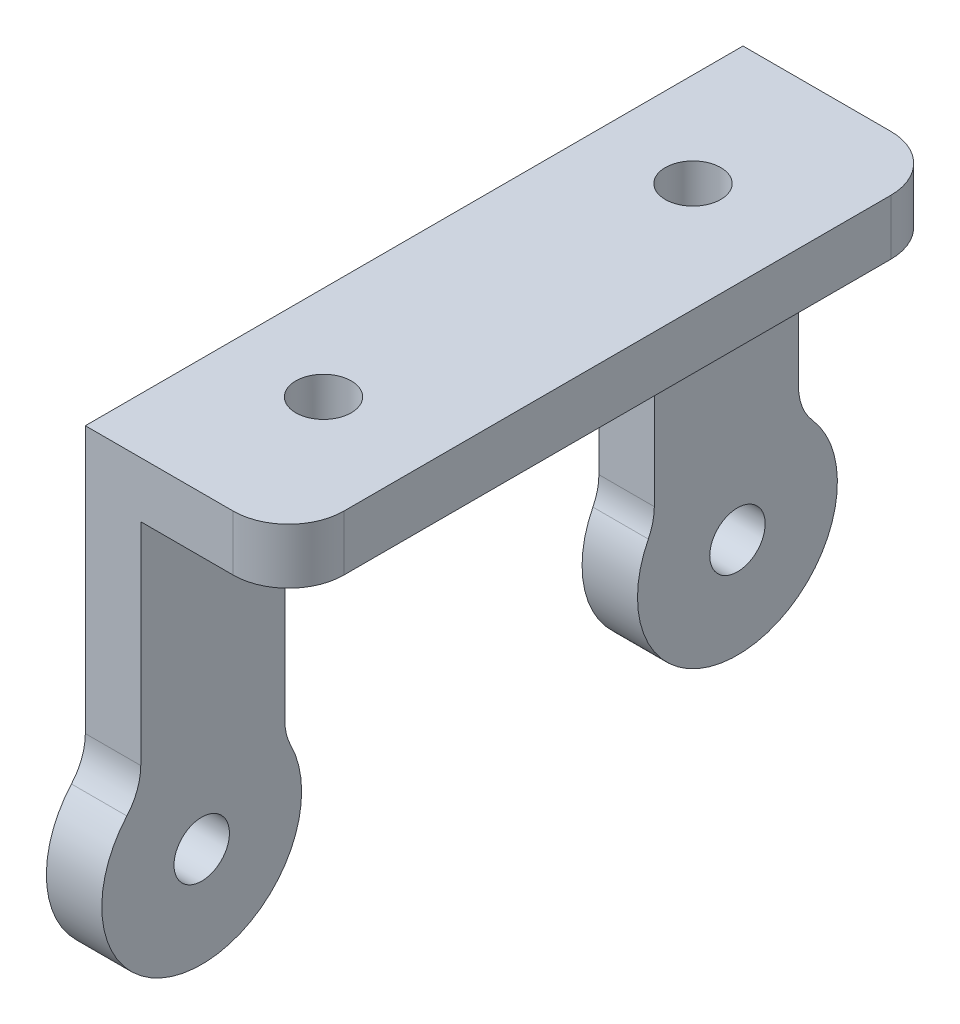
ISO-10303-21;
HEADER;
FILE_DESCRIPTION(('STEP AP214'),'2;1');
FILE_NAME('part.step','',(''),(''),'','','');
FILE_SCHEMA(('AUTOMOTIVE_DESIGN { 1 0 10303 214 1 1 1 1 }'));
ENDSEC;
DATA;
#1=APPLICATION_CONTEXT('core data for automotive mechanical design processes');
#2=APPLICATION_PROTOCOL_DEFINITION('international standard','automotive_design',2000,#1);
#3=PRODUCT_CONTEXT('',#1,'mechanical');
#4=PRODUCT('Part','Part','',(#3));
#5=PRODUCT_RELATED_PRODUCT_CATEGORY('part','',(#4));
#6=PRODUCT_DEFINITION_FORMATION('','',#4);
#7=PRODUCT_DEFINITION_CONTEXT('part definition',#1,'design');
#8=PRODUCT_DEFINITION('design','',#6,#7);
#9=PRODUCT_DEFINITION_SHAPE('','',#8);
#10=(LENGTH_UNIT() NAMED_UNIT(*) SI_UNIT(.MILLI.,.METRE.));
#11=(NAMED_UNIT(*) PLANE_ANGLE_UNIT() SI_UNIT($,.RADIAN.));
#12=(NAMED_UNIT(*) SI_UNIT($,.STERADIAN.) SOLID_ANGLE_UNIT());
#13=UNCERTAINTY_MEASURE_WITH_UNIT(LENGTH_MEASURE(1.E-05),#10,'distance_accuracy_value','');
#14=(GEOMETRIC_REPRESENTATION_CONTEXT(3) GLOBAL_UNCERTAINTY_ASSIGNED_CONTEXT((#13)) GLOBAL_UNIT_ASSIGNED_CONTEXT((#10,
#11,#12)) REPRESENTATION_CONTEXT('',''));
#15=CARTESIAN_POINT('',(0.,0.,0.));
#16=DIRECTION('',(0.,0.,1.));
#17=DIRECTION('',(1.,0.,0.));
#18=AXIS2_PLACEMENT_3D('',#15,#16,#17);
#19=CARTESIAN_POINT('',(3.,-15.,35.6));
#20=DIRECTION('',(-1.,0.,0.));
#21=DIRECTION('',(0.,-1.,0.));
#22=AXIS2_PLACEMENT_3D('',#19,#20,#21);
#23=PLANE('',#22);
#24=DIRECTION('',(0.,1.,0.));
#25=VECTOR('',#24,1.);
#26=CARTESIAN_POINT('',(3.,-15.,35.6));
#27=LINE('',#26,#25);
#28=CARTESIAN_POINT('',(3.,8.56865885821496,35.6));
#29=VERTEX_POINT('',#28);
#30=CARTESIAN_POINT('',(3.,20.,35.6));
#31=VERTEX_POINT('',#30);
#32=EDGE_CURVE('E201',#29,#31,#27,.T.);
#33=ORIENTED_EDGE('',*,*,#32,.F.);
#34=CARTESIAN_POINT('',(3.,8.56865885821496,38.6));
#35=DIRECTION('',(-1.,0.,0.));
#36=DIRECTION('',(0.,-1.,0.));
#37=AXIS2_PLACEMENT_3D('',#34,#35,#36);
#38=CIRCLE('',#37,3.);
#39=CARTESIAN_POINT('',(3.,6.58182167323032,36.3522282143504));
#40=VERTEX_POINT('',#39);
#41=EDGE_CURVE('E319',#29,#40,#38,.T.);
#42=ORIENTED_EDGE('',*,*,#41,.T.);
#43=CARTESIAN_POINT('',(3.,3.,32.3));
#44=DIRECTION('',(-1.,0.,0.));
#45=DIRECTION('',(0.,-1.,0.));
#46=AXIS2_PLACEMENT_3D('',#43,#44,#45);
#47=CIRCLE('',#46,5.40832691319599);
#48=CARTESIAN_POINT('',(3.,5.44504406971863,27.47591879244));
#49=VERTEX_POINT('',#48);
#50=EDGE_CURVE('E370',#49,#40,#47,.T.);
#51=ORIENTED_EDGE('',*,*,#50,.F.);
#52=CARTESIAN_POINT('',(3.,6.8013104949709,24.8));
#53=DIRECTION('',(-1.,0.,0.));
#54=DIRECTION('',(0.,-1.,0.));
#55=AXIS2_PLACEMENT_3D('',#52,#53,#54);
#56=CIRCLE('',#55,3.);
#57=CARTESIAN_POINT('',(3.,6.8013104949709,27.8));
#58=VERTEX_POINT('',#57);
#59=EDGE_CURVE('E339',#49,#58,#56,.T.);
#60=ORIENTED_EDGE('',*,*,#59,.T.);
#61=DIRECTION('',(0.,1.,0.));
#62=VECTOR('',#61,1.);
#63=CARTESIAN_POINT('',(3.,-15.,27.8));
#64=LINE('',#63,#62);
#65=CARTESIAN_POINT('',(3.,20.,27.8));
#66=VERTEX_POINT('',#65);
#67=EDGE_CURVE('E225',#58,#66,#64,.T.);
#68=ORIENTED_EDGE('',*,*,#67,.T.);
#69=DIRECTION('',(0.,0.,-1.));
#70=VECTOR('',#69,1.);
#71=CARTESIAN_POINT('',(3.,20.,35.6));
#72=LINE('',#71,#70);
#73=EDGE_CURVE('E159',#31,#66,#72,.T.);
#74=ORIENTED_EDGE('',*,*,#73,.F.);
#75=EDGE_LOOP('',(#33,#42,#51,#60,#68,#74));
#76=FACE_BOUND('',#75,.T.);
#77=CARTESIAN_POINT('',(3.,3.,32.3));
#78=DIRECTION('',(-1.,0.,0.));
#79=DIRECTION('',(0.,-1.,0.));
#80=AXIS2_PLACEMENT_3D('',#77,#78,#79);
#81=CIRCLE('',#80,1.5);
#82=CARTESIAN_POINT('',(3.,1.5,32.3));
#83=VERTEX_POINT('',#82);
#84=EDGE_CURVE('E361',#83,#83,#81,.T.);
#85=ORIENTED_EDGE('',*,*,#84,.T.);
#86=EDGE_LOOP('',(#85));
#87=FACE_BOUND('',#86,.T.);
#88=ADVANCED_FACE('F50',(#76,#87),#23,.F.);
#89=CARTESIAN_POINT('',(0.,23.,35.6));
#90=DIRECTION('',(1.,0.,0.));
#91=DIRECTION('',(0.,1.,0.));
#92=AXIS2_PLACEMENT_3D('',#89,#90,#91);
#93=PLANE('',#92);
#94=DIRECTION('',(0.,-1.,0.));
#95=VECTOR('',#94,1.);
#96=CARTESIAN_POINT('',(0.,23.,0.));
#97=LINE('',#96,#95);
#98=CARTESIAN_POINT('',(0.,23.,0.));
#99=VERTEX_POINT('',#98);
#100=CARTESIAN_POINT('',(0.,8.57118479320152,0.));
#101=VERTEX_POINT('',#100);
#102=EDGE_CURVE('E191',#99,#101,#97,.T.);
#103=ORIENTED_EDGE('',*,*,#102,.T.);
#104=CARTESIAN_POINT('',(0.,8.57118479320152,-3.));
#105=DIRECTION('',(1.,0.,0.));
#106=DIRECTION('',(0.,1.,0.));
#107=AXIS2_PLACEMENT_3D('',#104,#105,#106);
#108=CIRCLE('',#107,3.);
#109=CARTESIAN_POINT('',(0.,6.58384182297505,-0.752675386444706));
#110=VERTEX_POINT('',#109);
#111=EDGE_CURVE('E313',#101,#110,#108,.T.);
#112=ORIENTED_EDGE('',*,*,#111,.T.);
#113=CARTESIAN_POINT('',(0.,2.99999999999999,3.3));
#114=DIRECTION('',(-1.,0.,0.));
#115=DIRECTION('',(0.,-1.,0.));
#116=AXIS2_PLACEMENT_3D('',#113,#114,#115);
#117=CIRCLE('',#116,5.41);
#118=CARTESIAN_POINT('',(0.,5.44769361687676,8.12461355529132));
#119=VERTEX_POINT('',#118);
#120=EDGE_CURVE('E291',#110,#119,#117,.T.);
#121=ORIENTED_EDGE('',*,*,#120,.T.);
#122=CARTESIAN_POINT('',(0.,6.80500985544058,10.8));
#123=DIRECTION('',(1.,0.,0.));
#124=DIRECTION('',(0.,1.,0.));
#125=AXIS2_PLACEMENT_3D('',#122,#123,#124);
#126=CIRCLE('',#125,3.);
#127=CARTESIAN_POINT('',(0.,6.80500985544058,7.8));
#128=VERTEX_POINT('',#127);
#129=EDGE_CURVE('E228',#119,#128,#126,.T.);
#130=ORIENTED_EDGE('',*,*,#129,.T.);
#131=DIRECTION('',(0.,-1.,0.));
#132=VECTOR('',#131,1.);
#133=CARTESIAN_POINT('',(0.,-15.,7.8));
#134=LINE('',#133,#132);
#135=CARTESIAN_POINT('',(0.,20.,7.8));
#136=VERTEX_POINT('',#135);
#137=EDGE_CURVE('E54',#136,#128,#134,.T.);
#138=ORIENTED_EDGE('',*,*,#137,.F.);
#139=DIRECTION('',(0.,0.,-1.));
#140=VECTOR('',#139,1.);
#141=CARTESIAN_POINT('',(0.,20.,7.8));
#142=LINE('',#141,#140);
#143=CARTESIAN_POINT('',(0.,20.,27.8));
#144=VERTEX_POINT('',#143);
#145=EDGE_CURVE('E204',#144,#136,#142,.T.);
#146=ORIENTED_EDGE('',*,*,#145,.F.);
#147=DIRECTION('',(0.,1.,0.));
#148=VECTOR('',#147,1.);
#149=CARTESIAN_POINT('',(0.,-15.,27.8));
#150=LINE('',#149,#148);
#151=CARTESIAN_POINT('',(0.,6.8013104949709,27.8));
#152=VERTEX_POINT('',#151);
#153=EDGE_CURVE('E120',#152,#144,#150,.T.);
#154=ORIENTED_EDGE('',*,*,#153,.F.);
#155=CARTESIAN_POINT('',(0.,6.8013104949709,24.8));
#156=DIRECTION('',(1.,0.,0.));
#157=DIRECTION('',(0.,1.,0.));
#158=AXIS2_PLACEMENT_3D('',#155,#156,#157);
#159=CIRCLE('',#158,3.);
#160=CARTESIAN_POINT('',(0.,5.44504406971863,27.47591879244));
#161=VERTEX_POINT('',#160);
#162=EDGE_CURVE('E343',#152,#161,#159,.T.);
#163=ORIENTED_EDGE('',*,*,#162,.T.);
#164=CARTESIAN_POINT('',(0.,3.,32.3));
#165=DIRECTION('',(-1.,0.,0.));
#166=DIRECTION('',(0.,-1.,0.));
#167=AXIS2_PLACEMENT_3D('',#164,#165,#166);
#168=CIRCLE('',#167,5.40832691319599);
#169=CARTESIAN_POINT('',(0.,6.58182167323032,36.3522282143504));
#170=VERTEX_POINT('',#169);
#171=EDGE_CURVE('E369',#161,#170,#168,.T.);
#172=ORIENTED_EDGE('',*,*,#171,.T.);
#173=CARTESIAN_POINT('',(0.,8.56865885821496,38.6));
#174=DIRECTION('',(1.,0.,0.));
#175=DIRECTION('',(0.,1.,0.));
#176=AXIS2_PLACEMENT_3D('',#173,#174,#175);
#177=CIRCLE('',#176,3.);
#178=CARTESIAN_POINT('',(0.,8.56865885821496,35.6));
#179=VERTEX_POINT('',#178);
#180=EDGE_CURVE('E335',#170,#179,#177,.T.);
#181=ORIENTED_EDGE('',*,*,#180,.T.);
#182=DIRECTION('',(0.,-1.,0.));
#183=VECTOR('',#182,1.);
#184=CARTESIAN_POINT('',(0.,23.,35.6));
#185=LINE('',#184,#183);
#186=CARTESIAN_POINT('',(0.,23.,35.6));
#187=VERTEX_POINT('',#186);
#188=EDGE_CURVE('E137',#187,#179,#185,.T.);
#189=ORIENTED_EDGE('',*,*,#188,.F.);
#190=DIRECTION('',(0.,0.,-1.));
#191=VECTOR('',#190,1.);
#192=CARTESIAN_POINT('',(0.,23.,35.6));
#193=LINE('',#192,#191);
#194=EDGE_CURVE('E186',#187,#99,#193,.T.);
#195=ORIENTED_EDGE('',*,*,#194,.T.);
#196=EDGE_LOOP('',(#103,#112,#121,#130,#138,#146,#154,#163,#172,#181,#189,#195));
#197=FACE_BOUND('',#196,.T.);
#198=CARTESIAN_POINT('',(0.,2.99999999999999,3.3));
#199=DIRECTION('',(-1.,0.,0.));
#200=DIRECTION('',(0.,0.,1.));
#201=AXIS2_PLACEMENT_3D('',#198,#199,#200);
#202=CIRCLE('',#201,1.5);
#203=CARTESIAN_POINT('',(0.,2.99999999999999,4.8));
#204=VERTEX_POINT('',#203);
#205=EDGE_CURVE('E314',#204,#204,#202,.T.);
#206=ORIENTED_EDGE('',*,*,#205,.F.);
#207=EDGE_LOOP('',(#206));
#208=FACE_BOUND('',#207,.T.);
#209=CARTESIAN_POINT('',(0.,3.,32.3));
#210=DIRECTION('',(-1.,0.,0.));
#211=DIRECTION('',(0.,0.,-1.));
#212=AXIS2_PLACEMENT_3D('',#209,#210,#211);
#213=CIRCLE('',#212,1.5);
#214=CARTESIAN_POINT('',(0.,3.,30.8));
#215=VERTEX_POINT('',#214);
#216=EDGE_CURVE('E365',#215,#215,#213,.T.);
#217=ORIENTED_EDGE('',*,*,#216,.F.);
#218=EDGE_LOOP('',(#217));
#219=FACE_BOUND('',#218,.T.);
#220=ADVANCED_FACE('F52',(#197,#208,#219),#93,.F.);
#221=DIRECTION('',(0.,-1.,0.));
#222=VECTOR('',#221,1.);
#223=CARTESIAN_POINT('',(3.,-15.,7.8));
#224=LINE('',#223,#222);
#225=CARTESIAN_POINT('',(3.,20.,7.8));
#226=VERTEX_POINT('',#225);
#227=CARTESIAN_POINT('',(3.,6.80500985544058,7.8));
#228=VERTEX_POINT('',#227);
#229=EDGE_CURVE('E190',#226,#228,#224,.T.);
#230=ORIENTED_EDGE('',*,*,#229,.T.);
#231=CARTESIAN_POINT('',(3.,6.80500985544058,10.8));
#232=DIRECTION('',(-1.,0.,0.));
#233=DIRECTION('',(0.,-1.,0.));
#234=AXIS2_PLACEMENT_3D('',#231,#232,#233);
#235=CIRCLE('',#234,3.);
#236=CARTESIAN_POINT('',(3.,5.44769361687676,8.12461355529132));
#237=VERTEX_POINT('',#236);
#238=EDGE_CURVE('E298',#228,#237,#235,.T.);
#239=ORIENTED_EDGE('',*,*,#238,.T.);
#240=CARTESIAN_POINT('',(3.,2.99999999999999,3.3));
#241=DIRECTION('',(-1.,0.,0.));
#242=DIRECTION('',(0.,-1.,0.));
#243=AXIS2_PLACEMENT_3D('',#240,#241,#242);
#244=CIRCLE('',#243,5.41);
#245=CARTESIAN_POINT('',(3.,6.58384182297505,-0.752675386444706));
#246=VERTEX_POINT('',#245);
#247=EDGE_CURVE('E318',#246,#237,#244,.T.);
#248=ORIENTED_EDGE('',*,*,#247,.F.);
#249=CARTESIAN_POINT('',(3.,8.57118479320152,-3.));
#250=DIRECTION('',(-1.,0.,0.));
#251=DIRECTION('',(0.,-1.,0.));
#252=AXIS2_PLACEMENT_3D('',#249,#250,#251);
#253=CIRCLE('',#252,3.);
#254=CARTESIAN_POINT('',(3.,8.57118479320152,0.));
#255=VERTEX_POINT('',#254);
#256=EDGE_CURVE('E244',#246,#255,#253,.T.);
#257=ORIENTED_EDGE('',*,*,#256,.T.);
#258=DIRECTION('',(0.,1.,0.));
#259=VECTOR('',#258,1.);
#260=CARTESIAN_POINT('',(3.,-15.,0.));
#261=LINE('',#260,#259);
#262=CARTESIAN_POINT('',(3.,20.,0.));
#263=VERTEX_POINT('',#262);
#264=EDGE_CURVE('E221',#255,#263,#261,.T.);
#265=ORIENTED_EDGE('',*,*,#264,.T.);
#266=EDGE_CURVE('E146',#226,#263,#72,.T.);
#267=ORIENTED_EDGE('',*,*,#266,.F.);
#268=EDGE_LOOP('',(#230,#239,#248,#257,#265,#267));
#269=FACE_BOUND('',#268,.T.);
#270=CARTESIAN_POINT('',(3.,2.99999999999999,3.3));
#271=DIRECTION('',(-1.,0.,0.));
#272=DIRECTION('',(0.,-1.,0.));
#273=AXIS2_PLACEMENT_3D('',#270,#271,#272);
#274=CIRCLE('',#273,1.5);
#275=CARTESIAN_POINT('',(3.,1.49999999999999,3.3));
#276=VERTEX_POINT('',#275);
#277=EDGE_CURVE('E309',#276,#276,#274,.T.);
#278=ORIENTED_EDGE('',*,*,#277,.T.);
#279=EDGE_LOOP('',(#278));
#280=FACE_BOUND('',#279,.T.);
#281=ADVANCED_FACE('F239',(#269,#280),#23,.F.);
#282=CARTESIAN_POINT('',(0.,-15.,35.6));
#283=DIRECTION('',(0.,0.,1.));
#284=DIRECTION('',(1.,0.,0.));
#285=AXIS2_PLACEMENT_3D('',#282,#283,#284);
#286=PLANE('',#285);
#287=ORIENTED_EDGE('',*,*,#188,.T.);
#288=DIRECTION('',(1.,0.,0.));
#289=VECTOR('',#288,1.);
#290=CARTESIAN_POINT('',(3.,8.56865885821496,35.6));
#291=LINE('',#290,#289);
#292=EDGE_CURVE('E347',#179,#29,#291,.T.);
#293=ORIENTED_EDGE('',*,*,#292,.T.);
#294=ORIENTED_EDGE('',*,*,#32,.T.);
#295=DIRECTION('',(1.,0.,0.));
#296=VECTOR('',#295,1.);
#297=CARTESIAN_POINT('',(3.,20.,35.6));
#298=LINE('',#297,#296);
#299=CARTESIAN_POINT('',(8.,20.,35.6));
#300=VERTEX_POINT('',#299);
#301=EDGE_CURVE('E197',#31,#300,#298,.T.);
#302=ORIENTED_EDGE('',*,*,#301,.T.);
#303=DIRECTION('',(0.,1.,0.));
#304=VECTOR('',#303,1.);
#305=CARTESIAN_POINT('',(8.,23.,35.6));
#306=LINE('',#305,#304);
#307=CARTESIAN_POINT('',(8.,23.,35.6));
#308=VERTEX_POINT('',#307);
#309=EDGE_CURVE('E162',#300,#308,#306,.T.);
#310=ORIENTED_EDGE('',*,*,#309,.T.);
#311=DIRECTION('',(-1.,0.,0.));
#312=VECTOR('',#311,1.);
#313=CARTESIAN_POINT('',(11.,23.,35.6));
#314=LINE('',#313,#312);
#315=EDGE_CURVE('E194',#308,#187,#314,.T.);
#316=ORIENTED_EDGE('',*,*,#315,.T.);
#317=EDGE_LOOP('',(#287,#293,#294,#302,#310,#316));
#318=FACE_BOUND('',#317,.T.);
#319=ADVANCED_FACE('F271',(#318),#286,.T.);
#320=CARTESIAN_POINT('',(0.,-15.,0.));
#321=DIRECTION('',(0.,0.,1.));
#322=DIRECTION('',(1.,0.,0.));
#323=AXIS2_PLACEMENT_3D('',#320,#321,#322);
#324=PLANE('',#323);
#325=ORIENTED_EDGE('',*,*,#264,.F.);
#326=DIRECTION('',(-1.,0.,0.));
#327=VECTOR('',#326,1.);
#328=CARTESIAN_POINT('',(0.,8.57118479320152,0.));
#329=LINE('',#328,#327);
#330=EDGE_CURVE('E248',#255,#101,#329,.T.);
#331=ORIENTED_EDGE('',*,*,#330,.T.);
#332=ORIENTED_EDGE('',*,*,#102,.F.);
#333=DIRECTION('',(-1.,0.,0.));
#334=VECTOR('',#333,1.);
#335=CARTESIAN_POINT('',(11.,23.,0.));
#336=LINE('',#335,#334);
#337=CARTESIAN_POINT('',(8.,23.,0.));
#338=VERTEX_POINT('',#337);
#339=EDGE_CURVE('E133',#338,#99,#336,.T.);
#340=ORIENTED_EDGE('',*,*,#339,.F.);
#341=DIRECTION('',(0.,1.,0.));
#342=VECTOR('',#341,1.);
#343=CARTESIAN_POINT('',(8.,-15.,0.));
#344=LINE('',#343,#342);
#345=CARTESIAN_POINT('',(8.,20.,0.));
#346=VERTEX_POINT('',#345);
#347=EDGE_CURVE('E127',#338,#346,#344,.F.);
#348=ORIENTED_EDGE('',*,*,#347,.T.);
#349=DIRECTION('',(1.,0.,0.));
#350=VECTOR('',#349,1.);
#351=CARTESIAN_POINT('',(3.,20.,0.));
#352=LINE('',#351,#350);
#353=EDGE_CURVE('E131',#263,#346,#352,.T.);
#354=ORIENTED_EDGE('',*,*,#353,.F.);
#355=EDGE_LOOP('',(#325,#331,#332,#340,#348,#354));
#356=FACE_BOUND('',#355,.T.);
#357=ADVANCED_FACE('F130',(#356),#324,.F.);
#358=CARTESIAN_POINT('',(11.,-15.,27.8));
#359=DIRECTION('',(0.,0.,1.));
#360=DIRECTION('',(1.,0.,0.));
#361=AXIS2_PLACEMENT_3D('',#358,#359,#360);
#362=PLANE('',#361);
#363=ORIENTED_EDGE('',*,*,#67,.F.);
#364=DIRECTION('',(-1.,0.,0.));
#365=VECTOR('',#364,1.);
#366=CARTESIAN_POINT('',(11.,6.8013104949709,27.8));
#367=LINE('',#366,#365);
#368=EDGE_CURVE('E358',#58,#152,#367,.T.);
#369=ORIENTED_EDGE('',*,*,#368,.T.);
#370=ORIENTED_EDGE('',*,*,#153,.T.);
#371=DIRECTION('',(-1.,0.,0.));
#372=VECTOR('',#371,1.);
#373=CARTESIAN_POINT('',(11.,20.,27.8));
#374=LINE('',#373,#372);
#375=EDGE_CURVE('E180',#66,#144,#374,.T.);
#376=ORIENTED_EDGE('',*,*,#375,.F.);
#377=EDGE_LOOP('',(#363,#369,#370,#376));
#378=FACE_BOUND('',#377,.T.);
#379=ADVANCED_FACE('F439',(#378),#362,.F.);
#380=CARTESIAN_POINT('',(11.,-15.,7.8));
#381=DIRECTION('',(0.,0.,-1.));
#382=DIRECTION('',(-1.,0.,0.));
#383=AXIS2_PLACEMENT_3D('',#380,#381,#382);
#384=PLANE('',#383);
#385=ORIENTED_EDGE('',*,*,#137,.T.);
#386=DIRECTION('',(-1.,0.,0.));
#387=VECTOR('',#386,1.);
#388=CARTESIAN_POINT('',(11.,6.80500985544058,7.8));
#389=LINE('',#388,#387);
#390=EDGE_CURVE('E284',#128,#228,#389,.F.);
#391=ORIENTED_EDGE('',*,*,#390,.T.);
#392=ORIENTED_EDGE('',*,*,#229,.F.);
#393=DIRECTION('',(-1.,0.,0.));
#394=VECTOR('',#393,1.);
#395=CARTESIAN_POINT('',(11.,20.,7.8));
#396=LINE('',#395,#394);
#397=EDGE_CURVE('E113',#226,#136,#396,.T.);
#398=ORIENTED_EDGE('',*,*,#397,.T.);
#399=EDGE_LOOP('',(#385,#391,#392,#398));
#400=FACE_BOUND('',#399,.T.);
#401=ADVANCED_FACE('F282',(#400),#384,.F.);
#402=CARTESIAN_POINT('',(3.,20.,35.6));
#403=DIRECTION('',(0.,1.,0.));
#404=DIRECTION('',(0.,0.,1.));
#405=AXIS2_PLACEMENT_3D('',#402,#403,#404);
#406=PLANE('',#405);
#407=CARTESIAN_POINT('',(5.09406965299921,20.,7.8));
#408=DIRECTION('',(0.,1.,0.));
#409=DIRECTION('',(0.,0.,1.));
#410=AXIS2_PLACEMENT_3D('',#407,#408,#409);
#411=CIRCLE('',#410,1.5);
#412=CARTESIAN_POINT('',(5.09406965299921,20.,9.3));
#413=VERTEX_POINT('',#412);
#414=EDGE_CURVE('E207',#413,#413,#411,.T.);
#415=ORIENTED_EDGE('',*,*,#414,.T.);
#416=EDGE_LOOP('',(#415));
#417=FACE_BOUND('',#416,.T.);
#418=CARTESIAN_POINT('',(5.09406965299921,20.,27.8));
#419=DIRECTION('',(0.,1.,0.));
#420=DIRECTION('',(0.,0.,1.));
#421=AXIS2_PLACEMENT_3D('',#418,#419,#420);
#422=CIRCLE('',#421,1.5);
#423=CARTESIAN_POINT('',(5.09406965299921,20.,29.3));
#424=VERTEX_POINT('',#423);
#425=EDGE_CURVE('E148',#424,#424,#422,.T.);
#426=ORIENTED_EDGE('',*,*,#425,.T.);
#427=EDGE_LOOP('',(#426));
#428=FACE_BOUND('',#427,.T.);
#429=ORIENTED_EDGE('',*,*,#353,.T.);
#430=CARTESIAN_POINT('',(8.,20.,3.));
#431=DIRECTION('',(0.,1.,0.));
#432=DIRECTION('',(0.,0.,1.));
#433=AXIS2_PLACEMENT_3D('',#430,#431,#432);
#434=CIRCLE('',#433,3.);
#435=CARTESIAN_POINT('',(11.,20.,3.));
#436=VERTEX_POINT('',#435);
#437=EDGE_CURVE('E143',#346,#436,#434,.F.);
#438=ORIENTED_EDGE('',*,*,#437,.T.);
#439=DIRECTION('',(0.,0.,-1.));
#440=VECTOR('',#439,1.);
#441=CARTESIAN_POINT('',(11.,20.,35.6));
#442=LINE('',#441,#440);
#443=CARTESIAN_POINT('',(11.,20.,32.6));
#444=VERTEX_POINT('',#443);
#445=EDGE_CURVE('E174',#444,#436,#442,.T.);
#446=ORIENTED_EDGE('',*,*,#445,.F.);
#447=CARTESIAN_POINT('',(8.,20.,32.6));
#448=DIRECTION('',(0.,1.,0.));
#449=DIRECTION('',(0.,0.,1.));
#450=AXIS2_PLACEMENT_3D('',#447,#448,#449);
#451=CIRCLE('',#450,3.);
#452=EDGE_CURVE('E155',#444,#300,#451,.F.);
#453=ORIENTED_EDGE('',*,*,#452,.T.);
#454=ORIENTED_EDGE('',*,*,#301,.F.);
#455=ORIENTED_EDGE('',*,*,#73,.T.);
#456=ORIENTED_EDGE('',*,*,#375,.T.);
#457=ORIENTED_EDGE('',*,*,#145,.T.);
#458=ORIENTED_EDGE('',*,*,#397,.F.);
#459=ORIENTED_EDGE('',*,*,#266,.T.);
#460=EDGE_LOOP('',(#429,#438,#446,#453,#454,#455,#456,#457,#458,#459));
#461=FACE_BOUND('',#460,.T.);
#462=ADVANCED_FACE('F141',(#417,#428,#461),#406,.F.);
#463=CARTESIAN_POINT('',(11.,20.,35.6));
#464=DIRECTION('',(-1.,0.,0.));
#465=DIRECTION('',(0.,0.,1.));
#466=AXIS2_PLACEMENT_3D('',#463,#464,#465);
#467=PLANE('',#466);
#468=ORIENTED_EDGE('',*,*,#445,.T.);
#469=DIRECTION('',(0.,1.,0.));
#470=VECTOR('',#469,1.);
#471=CARTESIAN_POINT('',(11.,20.,3.));
#472=LINE('',#471,#470);
#473=CARTESIAN_POINT('',(11.,23.,3.));
#474=VERTEX_POINT('',#473);
#475=EDGE_CURVE('E153',#436,#474,#472,.T.);
#476=ORIENTED_EDGE('',*,*,#475,.T.);
#477=DIRECTION('',(0.,0.,-1.));
#478=VECTOR('',#477,1.);
#479=CARTESIAN_POINT('',(11.,23.,35.6));
#480=LINE('',#479,#478);
#481=CARTESIAN_POINT('',(11.,23.,32.6));
#482=VERTEX_POINT('',#481);
#483=EDGE_CURVE('E168',#482,#474,#480,.T.);
#484=ORIENTED_EDGE('',*,*,#483,.F.);
#485=DIRECTION('',(0.,1.,0.));
#486=VECTOR('',#485,1.);
#487=CARTESIAN_POINT('',(11.,20.,32.6));
#488=LINE('',#487,#486);
#489=EDGE_CURVE('E173',#482,#444,#488,.F.);
#490=ORIENTED_EDGE('',*,*,#489,.T.);
#491=EDGE_LOOP('',(#468,#476,#484,#490));
#492=FACE_BOUND('',#491,.T.);
#493=ADVANCED_FACE('F414',(#492),#467,.F.);
#494=CARTESIAN_POINT('',(11.,23.,35.6));
#495=DIRECTION('',(0.,-1.,0.));
#496=DIRECTION('',(0.,0.,-1.));
#497=AXIS2_PLACEMENT_3D('',#494,#495,#496);
#498=PLANE('',#497);
#499=CARTESIAN_POINT('',(5.09406965299921,23.,7.8));
#500=DIRECTION('',(0.,1.,0.));
#501=DIRECTION('',(0.,0.,1.));
#502=AXIS2_PLACEMENT_3D('',#499,#500,#501);
#503=CIRCLE('',#502,1.5);
#504=CARTESIAN_POINT('',(5.09406965299921,23.,9.3));
#505=VERTEX_POINT('',#504);
#506=EDGE_CURVE('E11',#505,#505,#503,.T.);
#507=ORIENTED_EDGE('',*,*,#506,.F.);
#508=EDGE_LOOP('',(#507));
#509=FACE_BOUND('',#508,.T.);
#510=CARTESIAN_POINT('',(5.09406965299921,23.,27.8));
#511=DIRECTION('',(0.,1.,0.));
#512=DIRECTION('',(0.,0.,-1.));
#513=AXIS2_PLACEMENT_3D('',#510,#511,#512);
#514=CIRCLE('',#513,1.5);
#515=CARTESIAN_POINT('',(5.09406965299921,23.,26.3));
#516=VERTEX_POINT('',#515);
#517=EDGE_CURVE('E61',#516,#516,#514,.T.);
#518=ORIENTED_EDGE('',*,*,#517,.F.);
#519=EDGE_LOOP('',(#518));
#520=FACE_BOUND('',#519,.T.);
#521=ORIENTED_EDGE('',*,*,#483,.T.);
#522=CARTESIAN_POINT('',(8.,23.,3.));
#523=DIRECTION('',(0.,-1.,0.));
#524=DIRECTION('',(0.,0.,-1.));
#525=AXIS2_PLACEMENT_3D('',#522,#523,#524);
#526=CIRCLE('',#525,3.);
#527=EDGE_CURVE('E165',#474,#338,#526,.F.);
#528=ORIENTED_EDGE('',*,*,#527,.T.);
#529=ORIENTED_EDGE('',*,*,#339,.T.);
#530=ORIENTED_EDGE('',*,*,#194,.F.);
#531=ORIENTED_EDGE('',*,*,#315,.F.);
#532=CARTESIAN_POINT('',(8.,23.,32.6));
#533=DIRECTION('',(0.,-1.,0.));
#534=DIRECTION('',(0.,0.,-1.));
#535=AXIS2_PLACEMENT_3D('',#532,#533,#534);
#536=CIRCLE('',#535,3.);
#537=EDGE_CURVE('E70',#308,#482,#536,.F.);
#538=ORIENTED_EDGE('',*,*,#537,.T.);
#539=EDGE_LOOP('',(#521,#528,#529,#530,#531,#538));
#540=FACE_BOUND('',#539,.T.);
#541=ADVANCED_FACE('F411',(#509,#520,#540),#498,.F.);
#542=CARTESIAN_POINT('',(5.09406965299921,-15.,27.8));
#543=DIRECTION('',(0.,1.,0.));
#544=DIRECTION('',(0.,0.,1.));
#545=AXIS2_PLACEMENT_3D('',#542,#543,#544);
#546=CYLINDRICAL_SURFACE('',#545,1.5);
#547=ORIENTED_EDGE('',*,*,#517,.T.);
#548=EDGE_LOOP('',(#547));
#549=FACE_BOUND('',#548,.T.);
#550=ORIENTED_EDGE('',*,*,#425,.F.);
#551=EDGE_LOOP('',(#550));
#552=FACE_BOUND('',#551,.T.);
#553=ADVANCED_FACE('F421',(#549,#552),#546,.F.);
#554=CARTESIAN_POINT('',(5.09406965299921,-15.,7.8));
#555=DIRECTION('',(0.,1.,0.));
#556=DIRECTION('',(0.,0.,1.));
#557=AXIS2_PLACEMENT_3D('',#554,#555,#556);
#558=CYLINDRICAL_SURFACE('',#557,1.5);
#559=ORIENTED_EDGE('',*,*,#506,.T.);
#560=EDGE_LOOP('',(#559));
#561=FACE_BOUND('',#560,.T.);
#562=ORIENTED_EDGE('',*,*,#414,.F.);
#563=EDGE_LOOP('',(#562));
#564=FACE_BOUND('',#563,.T.);
#565=ADVANCED_FACE('F478',(#561,#564),#558,.F.);
#566=CARTESIAN_POINT('',(8.,20.,3.));
#567=DIRECTION('',(0.,1.,0.));
#568=DIRECTION('',(0.,0.,1.));
#569=AXIS2_PLACEMENT_3D('',#566,#567,#568);
#570=CYLINDRICAL_SURFACE('',#569,3.);
#571=ORIENTED_EDGE('',*,*,#437,.F.);
#572=ORIENTED_EDGE('',*,*,#347,.F.);
#573=ORIENTED_EDGE('',*,*,#527,.F.);
#574=ORIENTED_EDGE('',*,*,#475,.F.);
#575=EDGE_LOOP('',(#571,#572,#573,#574));
#576=FACE_BOUND('',#575,.T.);
#577=ADVANCED_FACE('F151',(#576),#570,.T.);
#578=CARTESIAN_POINT('',(8.,-15.,32.6));
#579=DIRECTION('',(0.,-1.,0.));
#580=DIRECTION('',(0.,0.,-1.));
#581=AXIS2_PLACEMENT_3D('',#578,#579,#580);
#582=CYLINDRICAL_SURFACE('',#581,3.);
#583=ORIENTED_EDGE('',*,*,#452,.F.);
#584=ORIENTED_EDGE('',*,*,#489,.F.);
#585=ORIENTED_EDGE('',*,*,#537,.F.);
#586=ORIENTED_EDGE('',*,*,#309,.F.);
#587=EDGE_LOOP('',(#583,#584,#585,#586));
#588=FACE_BOUND('',#587,.T.);
#589=ADVANCED_FACE('F276',(#588),#582,.T.);
#590=CARTESIAN_POINT('',(11.,2.99999999999999,3.3));
#591=DIRECTION('',(-1.,0.,0.));
#592=DIRECTION('',(0.,0.,1.));
#593=AXIS2_PLACEMENT_3D('',#590,#591,#592);
#594=CYLINDRICAL_SURFACE('',#593,1.5);
#595=ORIENTED_EDGE('',*,*,#205,.T.);
#596=EDGE_LOOP('',(#595));
#597=FACE_BOUND('',#596,.T.);
#598=ORIENTED_EDGE('',*,*,#277,.F.);
#599=EDGE_LOOP('',(#598));
#600=FACE_BOUND('',#599,.T.);
#601=ADVANCED_FACE('F510',(#597,#600),#594,.F.);
#602=CARTESIAN_POINT('',(3.,2.99999999999999,3.3));
#603=DIRECTION('',(-1.,0.,0.));
#604=DIRECTION('',(0.,-1.,0.));
#605=AXIS2_PLACEMENT_3D('',#602,#603,#604);
#606=CYLINDRICAL_SURFACE('',#605,5.41);
#607=ORIENTED_EDGE('',*,*,#247,.T.);
#608=DIRECTION('',(-1.,0.,0.));
#609=VECTOR('',#608,1.);
#610=CARTESIAN_POINT('',(3.,5.44769361687676,8.12461355529132));
#611=LINE('',#610,#609);
#612=EDGE_CURVE('E305',#237,#119,#611,.T.);
#613=ORIENTED_EDGE('',*,*,#612,.T.);
#614=ORIENTED_EDGE('',*,*,#120,.F.);
#615=DIRECTION('',(-1.,0.,0.));
#616=VECTOR('',#615,1.);
#617=CARTESIAN_POINT('',(3.,6.58384182297505,-0.752675386444707));
#618=LINE('',#617,#616);
#619=EDGE_CURVE('E300',#110,#246,#618,.F.);
#620=ORIENTED_EDGE('',*,*,#619,.T.);
#621=EDGE_LOOP('',(#607,#613,#614,#620));
#622=FACE_BOUND('',#621,.T.);
#623=ADVANCED_FACE('F586',(#622),#606,.T.);
#624=CARTESIAN_POINT('',(3.,8.57118479320152,-3.));
#625=DIRECTION('',(-1.,0.,0.));
#626=DIRECTION('',(0.,-1.,0.));
#627=AXIS2_PLACEMENT_3D('',#624,#625,#626);
#628=CYLINDRICAL_SURFACE('',#627,3.);
#629=ORIENTED_EDGE('',*,*,#256,.F.);
#630=ORIENTED_EDGE('',*,*,#619,.F.);
#631=ORIENTED_EDGE('',*,*,#111,.F.);
#632=ORIENTED_EDGE('',*,*,#330,.F.);
#633=EDGE_LOOP('',(#629,#630,#631,#632));
#634=FACE_BOUND('',#633,.T.);
#635=ADVANCED_FACE('F596',(#634),#628,.F.);
#636=CARTESIAN_POINT('',(3.,6.80500985544058,10.8));
#637=DIRECTION('',(-1.,0.,0.));
#638=DIRECTION('',(0.,-1.,0.));
#639=AXIS2_PLACEMENT_3D('',#636,#637,#638);
#640=CYLINDRICAL_SURFACE('',#639,3.);
#641=ORIENTED_EDGE('',*,*,#129,.F.);
#642=ORIENTED_EDGE('',*,*,#612,.F.);
#643=ORIENTED_EDGE('',*,*,#238,.F.);
#644=ORIENTED_EDGE('',*,*,#390,.F.);
#645=EDGE_LOOP('',(#641,#642,#643,#644));
#646=FACE_BOUND('',#645,.T.);
#647=ADVANCED_FACE('F297',(#646),#640,.F.);
#648=CARTESIAN_POINT('',(3.,3.,32.3));
#649=DIRECTION('',(-1.,0.,0.));
#650=DIRECTION('',(0.,-1.,0.));
#651=AXIS2_PLACEMENT_3D('',#648,#649,#650);
#652=CYLINDRICAL_SURFACE('',#651,5.40832691319599);
#653=ORIENTED_EDGE('',*,*,#171,.F.);
#654=DIRECTION('',(-1.,0.,0.));
#655=VECTOR('',#654,1.);
#656=CARTESIAN_POINT('',(3.,5.44504406971863,27.47591879244));
#657=LINE('',#656,#655);
#658=EDGE_CURVE('E350',#161,#49,#657,.F.);
#659=ORIENTED_EDGE('',*,*,#658,.T.);
#660=ORIENTED_EDGE('',*,*,#50,.T.);
#661=DIRECTION('',(-1.,0.,0.));
#662=VECTOR('',#661,1.);
#663=CARTESIAN_POINT('',(3.,6.58182167323032,36.3522282143504));
#664=LINE('',#663,#662);
#665=EDGE_CURVE('E354',#40,#170,#664,.T.);
#666=ORIENTED_EDGE('',*,*,#665,.T.);
#667=EDGE_LOOP('',(#653,#659,#660,#666));
#668=FACE_BOUND('',#667,.T.);
#669=ADVANCED_FACE('F387',(#668),#652,.T.);
#670=CARTESIAN_POINT('',(11.,3.,32.3));
#671=DIRECTION('',(-1.,0.,0.));
#672=DIRECTION('',(0.,0.,1.));
#673=AXIS2_PLACEMENT_3D('',#670,#671,#672);
#674=CYLINDRICAL_SURFACE('',#673,1.5);
#675=ORIENTED_EDGE('',*,*,#216,.T.);
#676=EDGE_LOOP('',(#675));
#677=FACE_BOUND('',#676,.T.);
#678=ORIENTED_EDGE('',*,*,#84,.F.);
#679=EDGE_LOOP('',(#678));
#680=FACE_BOUND('',#679,.T.);
#681=ADVANCED_FACE('F622',(#677,#680),#674,.F.);
#682=CARTESIAN_POINT('',(3.,8.56865885821496,38.6));
#683=DIRECTION('',(-1.,0.,0.));
#684=DIRECTION('',(0.,-1.,0.));
#685=AXIS2_PLACEMENT_3D('',#682,#683,#684);
#686=CYLINDRICAL_SURFACE('',#685,3.);
#687=ORIENTED_EDGE('',*,*,#41,.F.);
#688=ORIENTED_EDGE('',*,*,#292,.F.);
#689=ORIENTED_EDGE('',*,*,#180,.F.);
#690=ORIENTED_EDGE('',*,*,#665,.F.);
#691=EDGE_LOOP('',(#687,#688,#689,#690));
#692=FACE_BOUND('',#691,.T.);
#693=ADVANCED_FACE('F631',(#692),#686,.F.);
#694=CARTESIAN_POINT('',(3.,6.8013104949709,24.8));
#695=DIRECTION('',(-1.,0.,0.));
#696=DIRECTION('',(0.,-1.,0.));
#697=AXIS2_PLACEMENT_3D('',#694,#695,#696);
#698=CYLINDRICAL_SURFACE('',#697,3.);
#699=ORIENTED_EDGE('',*,*,#59,.F.);
#700=ORIENTED_EDGE('',*,*,#658,.F.);
#701=ORIENTED_EDGE('',*,*,#162,.F.);
#702=ORIENTED_EDGE('',*,*,#368,.F.);
#703=EDGE_LOOP('',(#699,#700,#701,#702));
#704=FACE_BOUND('',#703,.T.);
#705=ADVANCED_FACE('F395',(#704),#698,.F.);
#706=CLOSED_SHELL('',(#88,#220,#281,#319,#357,#379,#401,#462,#493,#541,#553,#565,#577,#589,#601,
#623,#635,#647,#669,#681,#693,#705));
#707=MANIFOLD_SOLID_BREP('B2',#706);
#708=ADVANCED_BREP_SHAPE_REPRESENTATION('',(#18,#707),#14);
#709=SHAPE_DEFINITION_REPRESENTATION(#9,#708);
ENDSEC;
END-ISO-10303-21;
